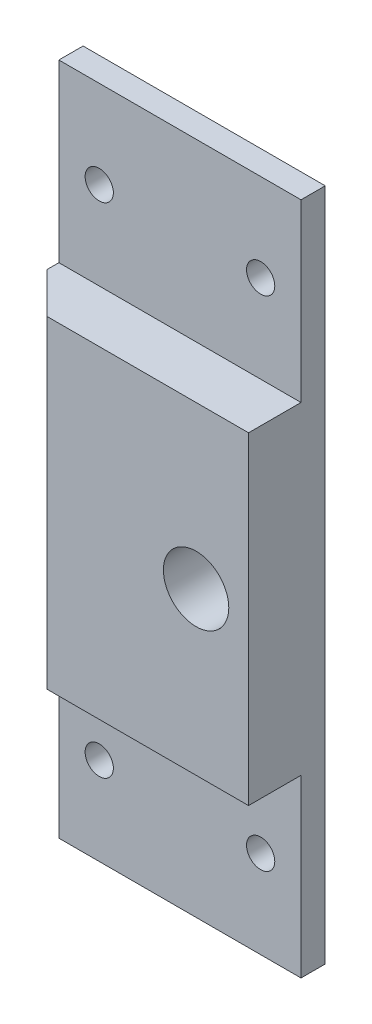
ISO-10303-21;
HEADER;
FILE_DESCRIPTION(('STEP AP214'),'2;1');
FILE_NAME('part.step','',(''),(''),'','','');
FILE_SCHEMA(('AUTOMOTIVE_DESIGN { 1 0 10303 214 1 1 1 1 }'));
ENDSEC;
DATA;
#1=APPLICATION_CONTEXT('core data for automotive mechanical design processes');
#2=APPLICATION_PROTOCOL_DEFINITION('international standard','automotive_design',2000,#1);
#3=PRODUCT_CONTEXT('',#1,'mechanical');
#4=PRODUCT('Part','Part','',(#3));
#5=PRODUCT_RELATED_PRODUCT_CATEGORY('part','',(#4));
#6=PRODUCT_DEFINITION_FORMATION('','',#4);
#7=PRODUCT_DEFINITION_CONTEXT('part definition',#1,'design');
#8=PRODUCT_DEFINITION('design','',#6,#7);
#9=PRODUCT_DEFINITION_SHAPE('','',#8);
#10=(LENGTH_UNIT() NAMED_UNIT(*) SI_UNIT(.MILLI.,.METRE.));
#11=(NAMED_UNIT(*) PLANE_ANGLE_UNIT() SI_UNIT($,.RADIAN.));
#12=(NAMED_UNIT(*) SI_UNIT($,.STERADIAN.) SOLID_ANGLE_UNIT());
#13=UNCERTAINTY_MEASURE_WITH_UNIT(LENGTH_MEASURE(1.E-05),#10,'distance_accuracy_value','');
#14=(GEOMETRIC_REPRESENTATION_CONTEXT(3) GLOBAL_UNCERTAINTY_ASSIGNED_CONTEXT((#13)) GLOBAL_UNIT_ASSIGNED_CONTEXT((#10,
#11,#12)) REPRESENTATION_CONTEXT('',''));
#15=CARTESIAN_POINT('',(0.,0.,0.));
#16=DIRECTION('',(0.,0.,1.));
#17=DIRECTION('',(1.,0.,0.));
#18=AXIS2_PLACEMENT_3D('',#15,#16,#17);
#19=CARTESIAN_POINT('',(0.,167.,3.));
#20=DIRECTION('',(0.,0.,-1.));
#21=DIRECTION('',(-1.,0.,0.));
#22=AXIS2_PLACEMENT_3D('',#19,#20,#21);
#23=PLANE('',#22);
#24=CARTESIAN_POINT('',(25.,94.375,3.));
#25=DIRECTION('',(0.,0.,1.));
#26=DIRECTION('',(1.,0.,0.));
#27=AXIS2_PLACEMENT_3D('',#24,#25,#26);
#28=CIRCLE('',#27,1.75);
#29=CARTESIAN_POINT('',(26.75,94.375,3.));
#30=VERTEX_POINT('',#29);
#31=EDGE_CURVE('E186',#30,#30,#28,.T.);
#32=ORIENTED_EDGE('',*,*,#31,.F.);
#33=EDGE_LOOP('',(#32));
#34=FACE_BOUND('',#33,.T.);
#35=CARTESIAN_POINT('',(5.,94.375,3.));
#36=DIRECTION('',(0.,0.,1.));
#37=DIRECTION('',(1.,0.,0.));
#38=AXIS2_PLACEMENT_3D('',#35,#36,#37);
#39=CIRCLE('',#38,1.75);
#40=CARTESIAN_POINT('',(6.75,94.375,3.));
#41=VERTEX_POINT('',#40);
#42=EDGE_CURVE('E182',#41,#41,#39,.T.);
#43=ORIENTED_EDGE('',*,*,#42,.F.);
#44=EDGE_LOOP('',(#43));
#45=FACE_BOUND('',#44,.T.);
#46=DIRECTION('',(-1.,0.,0.));
#47=VECTOR('',#46,1.);
#48=CARTESIAN_POINT('',(0.,105.25,3.));
#49=LINE('',#48,#47);
#50=CARTESIAN_POINT('',(30.,105.25,3.));
#51=VERTEX_POINT('',#50);
#52=CARTESIAN_POINT('',(0.,105.25,3.));
#53=VERTEX_POINT('',#52);
#54=EDGE_CURVE('E114',#51,#53,#49,.T.);
#55=ORIENTED_EDGE('',*,*,#54,.T.);
#56=DIRECTION('',(0.,1.,0.));
#57=VECTOR('',#56,1.);
#58=CARTESIAN_POINT('',(0.,167.,3.));
#59=LINE('',#58,#57);
#60=CARTESIAN_POINT('',(0.,83.5,3.));
#61=VERTEX_POINT('',#60);
#62=EDGE_CURVE('E135',#61,#53,#59,.T.);
#63=ORIENTED_EDGE('',*,*,#62,.F.);
#64=DIRECTION('',(-1.,0.,0.));
#65=VECTOR('',#64,1.);
#66=CARTESIAN_POINT('',(0.,83.5,3.));
#67=LINE('',#66,#65);
#68=CARTESIAN_POINT('',(30.,83.5,3.));
#69=VERTEX_POINT('',#68);
#70=EDGE_CURVE('E144',#69,#61,#67,.T.);
#71=ORIENTED_EDGE('',*,*,#70,.F.);
#72=DIRECTION('',(0.,-1.,0.));
#73=VECTOR('',#72,1.);
#74=CARTESIAN_POINT('',(30.,167.,3.));
#75=LINE('',#74,#73);
#76=EDGE_CURVE('E142',#51,#69,#75,.T.);
#77=ORIENTED_EDGE('',*,*,#76,.F.);
#78=EDGE_LOOP('',(#55,#63,#71,#77));
#79=FACE_BOUND('',#78,.T.);
#80=ADVANCED_FACE('F35',(#34,#45,#79),#23,.F.);
#81=CARTESIAN_POINT('',(25.,156.125,3.));
#82=DIRECTION('',(0.,0.,-1.));
#83=DIRECTION('',(1.,0.,0.));
#84=AXIS2_PLACEMENT_3D('',#81,#82,#83);
#85=CIRCLE('',#84,1.75);
#86=CARTESIAN_POINT('',(26.75,156.125,3.));
#87=VERTEX_POINT('',#86);
#88=EDGE_CURVE('E178',#87,#87,#85,.T.);
#89=ORIENTED_EDGE('',*,*,#88,.T.);
#90=EDGE_LOOP('',(#89));
#91=FACE_BOUND('',#90,.T.);
#92=CARTESIAN_POINT('',(5.,156.125,3.));
#93=DIRECTION('',(0.,0.,-1.));
#94=DIRECTION('',(1.,0.,0.));
#95=AXIS2_PLACEMENT_3D('',#92,#93,#94);
#96=CIRCLE('',#95,1.75);
#97=CARTESIAN_POINT('',(6.75,156.125,3.));
#98=VERTEX_POINT('',#97);
#99=EDGE_CURVE('E174',#98,#98,#96,.T.);
#100=ORIENTED_EDGE('',*,*,#99,.T.);
#101=EDGE_LOOP('',(#100));
#102=FACE_BOUND('',#101,.T.);
#103=DIRECTION('',(1.,0.,0.));
#104=VECTOR('',#103,1.);
#105=CARTESIAN_POINT('',(0.,145.25,3.));
#106=LINE('',#105,#104);
#107=CARTESIAN_POINT('',(0.,145.25,3.));
#108=VERTEX_POINT('',#107);
#109=CARTESIAN_POINT('',(30.,145.25,3.));
#110=VERTEX_POINT('',#109);
#111=EDGE_CURVE('E173',#108,#110,#106,.T.);
#112=ORIENTED_EDGE('',*,*,#111,.T.);
#113=CARTESIAN_POINT('',(30.,167.,3.));
#114=VERTEX_POINT('',#113);
#115=EDGE_CURVE('E124',#114,#110,#75,.T.);
#116=ORIENTED_EDGE('',*,*,#115,.F.);
#117=DIRECTION('',(1.,0.,0.));
#118=VECTOR('',#117,1.);
#119=CARTESIAN_POINT('',(0.,167.,3.));
#120=LINE('',#119,#118);
#121=CARTESIAN_POINT('',(0.,167.,3.));
#122=VERTEX_POINT('',#121);
#123=EDGE_CURVE('E138',#122,#114,#120,.T.);
#124=ORIENTED_EDGE('',*,*,#123,.F.);
#125=EDGE_CURVE('E139',#108,#122,#59,.T.);
#126=ORIENTED_EDGE('',*,*,#125,.F.);
#127=EDGE_LOOP('',(#112,#116,#124,#126));
#128=FACE_BOUND('',#127,.T.);
#129=ADVANCED_FACE('F228',(#91,#102,#128),#23,.F.);
#130=CARTESIAN_POINT('',(0.,167.,3.));
#131=DIRECTION('',(1.,0.,0.));
#132=DIRECTION('',(0.,0.,-1.));
#133=AXIS2_PLACEMENT_3D('',#130,#131,#132);
#134=PLANE('',#133);
#135=DIRECTION('',(0.,0.,-1.));
#136=VECTOR('',#135,1.);
#137=CARTESIAN_POINT('',(0.,145.25,9.5));
#138=LINE('',#137,#136);
#139=CARTESIAN_POINT('',(0.,145.25,4.49999999999997));
#140=VERTEX_POINT('',#139);
#141=EDGE_CURVE('E126',#140,#108,#138,.T.);
#142=ORIENTED_EDGE('',*,*,#141,.T.);
#143=ORIENTED_EDGE('',*,*,#125,.T.);
#144=DIRECTION('',(0.,0.,-1.));
#145=VECTOR('',#144,1.);
#146=CARTESIAN_POINT('',(0.,167.,3.));
#147=LINE('',#146,#145);
#148=CARTESIAN_POINT('',(0.,167.,0.));
#149=VERTEX_POINT('',#148);
#150=EDGE_CURVE('E166',#122,#149,#147,.T.);
#151=ORIENTED_EDGE('',*,*,#150,.T.);
#152=DIRECTION('',(0.,1.,0.));
#153=VECTOR('',#152,1.);
#154=CARTESIAN_POINT('',(0.,167.,0.));
#155=LINE('',#154,#153);
#156=CARTESIAN_POINT('',(0.,83.5,0.));
#157=VERTEX_POINT('',#156);
#158=EDGE_CURVE('E129',#157,#149,#155,.T.);
#159=ORIENTED_EDGE('',*,*,#158,.F.);
#160=DIRECTION('',(0.,0.,-1.));
#161=VECTOR('',#160,1.);
#162=CARTESIAN_POINT('',(0.,83.5,3.));
#163=LINE('',#162,#161);
#164=EDGE_CURVE('E147',#61,#157,#163,.T.);
#165=ORIENTED_EDGE('',*,*,#164,.F.);
#166=ORIENTED_EDGE('',*,*,#62,.T.);
#167=DIRECTION('',(0.,0.,-1.));
#168=VECTOR('',#167,1.);
#169=CARTESIAN_POINT('',(0.,105.25,9.5));
#170=LINE('',#169,#168);
#171=CARTESIAN_POINT('',(0.,105.25,4.49999999999997));
#172=VERTEX_POINT('',#171);
#173=EDGE_CURVE('E131',#172,#53,#170,.T.);
#174=ORIENTED_EDGE('',*,*,#173,.F.);
#175=DIRECTION('',(0.,-1.,0.));
#176=VECTOR('',#175,1.);
#177=CARTESIAN_POINT('',(0.,105.25,4.49999999999997));
#178=LINE('',#177,#176);
#179=EDGE_CURVE('E43',#140,#172,#178,.T.);
#180=ORIENTED_EDGE('',*,*,#179,.F.);
#181=EDGE_LOOP('',(#142,#143,#151,#159,#165,#166,#174,#180));
#182=FACE_BOUND('',#181,.T.);
#183=ADVANCED_FACE('F190',(#182),#134,.F.);
#184=CARTESIAN_POINT('',(0.,167.,3.));
#185=DIRECTION('',(0.,-1.,0.));
#186=DIRECTION('',(0.,0.,1.));
#187=AXIS2_PLACEMENT_3D('',#184,#185,#186);
#188=PLANE('',#187);
#189=DIRECTION('',(1.,0.,0.));
#190=VECTOR('',#189,1.);
#191=CARTESIAN_POINT('',(0.,167.,0.));
#192=LINE('',#191,#190);
#193=CARTESIAN_POINT('',(30.,167.,0.));
#194=VERTEX_POINT('',#193);
#195=EDGE_CURVE('E150',#149,#194,#192,.T.);
#196=ORIENTED_EDGE('',*,*,#195,.F.);
#197=ORIENTED_EDGE('',*,*,#150,.F.);
#198=ORIENTED_EDGE('',*,*,#123,.T.);
#199=DIRECTION('',(0.,0.,-1.));
#200=VECTOR('',#199,1.);
#201=CARTESIAN_POINT('',(30.,167.,3.));
#202=LINE('',#201,#200);
#203=EDGE_CURVE('E163',#114,#194,#202,.T.);
#204=ORIENTED_EDGE('',*,*,#203,.T.);
#205=EDGE_LOOP('',(#196,#197,#198,#204));
#206=FACE_BOUND('',#205,.T.);
#207=ADVANCED_FACE('F250',(#206),#188,.F.);
#208=CARTESIAN_POINT('',(30.,167.,3.));
#209=DIRECTION('',(-1.,0.,0.));
#210=DIRECTION('',(0.,0.,1.));
#211=AXIS2_PLACEMENT_3D('',#208,#209,#210);
#212=PLANE('',#211);
#213=DIRECTION('',(0.,-1.,0.));
#214=VECTOR('',#213,1.);
#215=CARTESIAN_POINT('',(30.,167.,0.));
#216=LINE('',#215,#214);
#217=CARTESIAN_POINT('',(30.,83.5,0.));
#218=VERTEX_POINT('',#217);
#219=EDGE_CURVE('E153',#194,#218,#216,.T.);
#220=ORIENTED_EDGE('',*,*,#219,.F.);
#221=ORIENTED_EDGE('',*,*,#203,.F.);
#222=ORIENTED_EDGE('',*,*,#115,.T.);
#223=DIRECTION('',(0.,0.,-1.));
#224=VECTOR('',#223,1.);
#225=CARTESIAN_POINT('',(30.,145.25,9.5));
#226=LINE('',#225,#224);
#227=CARTESIAN_POINT('',(30.,145.25,9.5));
#228=VERTEX_POINT('',#227);
#229=EDGE_CURVE('E109',#228,#110,#226,.T.);
#230=ORIENTED_EDGE('',*,*,#229,.F.);
#231=DIRECTION('',(0.,-1.,0.));
#232=VECTOR('',#231,1.);
#233=CARTESIAN_POINT('',(30.,105.25,9.5));
#234=LINE('',#233,#232);
#235=CARTESIAN_POINT('',(30.,105.25,9.5));
#236=VERTEX_POINT('',#235);
#237=EDGE_CURVE('E113',#228,#236,#234,.T.);
#238=ORIENTED_EDGE('',*,*,#237,.T.);
#239=DIRECTION('',(0.,0.,-1.));
#240=VECTOR('',#239,1.);
#241=CARTESIAN_POINT('',(30.,105.25,9.5));
#242=LINE('',#241,#240);
#243=EDGE_CURVE('E127',#236,#51,#242,.T.);
#244=ORIENTED_EDGE('',*,*,#243,.T.);
#245=ORIENTED_EDGE('',*,*,#76,.T.);
#246=DIRECTION('',(0.,0.,-1.));
#247=VECTOR('',#246,1.);
#248=CARTESIAN_POINT('',(30.,83.5,3.));
#249=LINE('',#248,#247);
#250=EDGE_CURVE('E160',#69,#218,#249,.T.);
#251=ORIENTED_EDGE('',*,*,#250,.T.);
#252=EDGE_LOOP('',(#220,#221,#222,#230,#238,#244,#245,#251));
#253=FACE_BOUND('',#252,.T.);
#254=ADVANCED_FACE('F122',(#253),#212,.F.);
#255=CARTESIAN_POINT('',(0.,83.5,3.));
#256=DIRECTION('',(0.,1.,0.));
#257=DIRECTION('',(0.,0.,-1.));
#258=AXIS2_PLACEMENT_3D('',#255,#256,#257);
#259=PLANE('',#258);
#260=DIRECTION('',(-1.,0.,0.));
#261=VECTOR('',#260,1.);
#262=CARTESIAN_POINT('',(0.,83.5,0.));
#263=LINE('',#262,#261);
#264=EDGE_CURVE('E156',#218,#157,#263,.T.);
#265=ORIENTED_EDGE('',*,*,#264,.F.);
#266=ORIENTED_EDGE('',*,*,#250,.F.);
#267=ORIENTED_EDGE('',*,*,#70,.T.);
#268=ORIENTED_EDGE('',*,*,#164,.T.);
#269=EDGE_LOOP('',(#265,#266,#267,#268));
#270=FACE_BOUND('',#269,.T.);
#271=ADVANCED_FACE('F243',(#270),#259,.F.);
#272=CARTESIAN_POINT('',(0.,167.,0.));
#273=DIRECTION('',(0.,0.,-1.));
#274=DIRECTION('',(-1.,0.,0.));
#275=AXIS2_PLACEMENT_3D('',#272,#273,#274);
#276=PLANE('',#275);
#277=CARTESIAN_POINT('',(23.5,125.25,0.));
#278=DIRECTION('',(0.,0.,1.));
#279=DIRECTION('',(-1.,0.,0.));
#280=AXIS2_PLACEMENT_3D('',#277,#278,#279);
#281=CIRCLE('',#280,4.05);
#282=CARTESIAN_POINT('',(27.55,125.25,0.));
#283=VERTEX_POINT('',#282);
#284=EDGE_CURVE('E206',#283,#283,#281,.T.);
#285=ORIENTED_EDGE('',*,*,#284,.T.);
#286=EDGE_LOOP('',(#285));
#287=FACE_BOUND('',#286,.T.);
#288=CARTESIAN_POINT('',(25.,94.375,0.));
#289=DIRECTION('',(0.,0.,1.));
#290=DIRECTION('',(-1.,0.,0.));
#291=AXIS2_PLACEMENT_3D('',#288,#289,#290);
#292=CIRCLE('',#291,1.75);
#293=CARTESIAN_POINT('',(23.25,94.375,0.));
#294=VERTEX_POINT('',#293);
#295=EDGE_CURVE('E183',#294,#294,#292,.F.);
#296=ORIENTED_EDGE('',*,*,#295,.F.);
#297=EDGE_LOOP('',(#296));
#298=FACE_BOUND('',#297,.T.);
#299=CARTESIAN_POINT('',(5.,94.375,0.));
#300=DIRECTION('',(0.,0.,1.));
#301=DIRECTION('',(-1.,0.,0.));
#302=AXIS2_PLACEMENT_3D('',#299,#300,#301);
#303=CIRCLE('',#302,1.75);
#304=CARTESIAN_POINT('',(3.25,94.375,0.));
#305=VERTEX_POINT('',#304);
#306=EDGE_CURVE('E179',#305,#305,#303,.F.);
#307=ORIENTED_EDGE('',*,*,#306,.F.);
#308=EDGE_LOOP('',(#307));
#309=FACE_BOUND('',#308,.T.);
#310=CARTESIAN_POINT('',(25.,156.125,0.));
#311=DIRECTION('',(0.,0.,1.));
#312=DIRECTION('',(-1.,0.,0.));
#313=AXIS2_PLACEMENT_3D('',#310,#311,#312);
#314=CIRCLE('',#313,1.75);
#315=CARTESIAN_POINT('',(23.25,156.125,0.));
#316=VERTEX_POINT('',#315);
#317=EDGE_CURVE('E175',#316,#316,#314,.T.);
#318=ORIENTED_EDGE('',*,*,#317,.T.);
#319=EDGE_LOOP('',(#318));
#320=FACE_BOUND('',#319,.T.);
#321=CARTESIAN_POINT('',(5.,156.125,0.));
#322=DIRECTION('',(0.,0.,1.));
#323=DIRECTION('',(-1.,0.,0.));
#324=AXIS2_PLACEMENT_3D('',#321,#322,#323);
#325=CIRCLE('',#324,1.75);
#326=CARTESIAN_POINT('',(3.25,156.125,0.));
#327=VERTEX_POINT('',#326);
#328=EDGE_CURVE('E170',#327,#327,#325,.T.);
#329=ORIENTED_EDGE('',*,*,#328,.T.);
#330=EDGE_LOOP('',(#329));
#331=FACE_BOUND('',#330,.T.);
#332=ORIENTED_EDGE('',*,*,#158,.T.);
#333=ORIENTED_EDGE('',*,*,#195,.T.);
#334=ORIENTED_EDGE('',*,*,#219,.T.);
#335=ORIENTED_EDGE('',*,*,#264,.T.);
#336=EDGE_LOOP('',(#332,#333,#334,#335));
#337=FACE_BOUND('',#336,.T.);
#338=ADVANCED_FACE('F240',(#287,#298,#309,#320,#331,#337),#276,.T.);
#339=CARTESIAN_POINT('',(0.,145.25,9.5));
#340=DIRECTION('',(0.,-1.,0.));
#341=DIRECTION('',(0.,0.,1.));
#342=AXIS2_PLACEMENT_3D('',#339,#340,#341);
#343=PLANE('',#342);
#344=DIRECTION('',(1.,0.,0.));
#345=VECTOR('',#344,1.);
#346=CARTESIAN_POINT('',(0.,145.25,9.5));
#347=LINE('',#346,#345);
#348=CARTESIAN_POINT('',(5.00000000000002,145.25,9.5));
#349=VERTEX_POINT('',#348);
#350=EDGE_CURVE('E104',#349,#228,#347,.T.);
#351=ORIENTED_EDGE('',*,*,#350,.T.);
#352=ORIENTED_EDGE('',*,*,#229,.T.);
#353=ORIENTED_EDGE('',*,*,#111,.F.);
#354=ORIENTED_EDGE('',*,*,#141,.F.);
#355=DIRECTION('',(-0.707106781186546,0.,-0.707106781186548));
#356=VECTOR('',#355,1.);
#357=CARTESIAN_POINT('',(5.00000000000002,145.25,9.5));
#358=LINE('',#357,#356);
#359=EDGE_CURVE('E55',#349,#140,#358,.T.);
#360=ORIENTED_EDGE('',*,*,#359,.F.);
#361=EDGE_LOOP('',(#351,#352,#353,#354,#360));
#362=FACE_BOUND('',#361,.T.);
#363=ADVANCED_FACE('F106',(#362),#343,.F.);
#364=CARTESIAN_POINT('',(0.,105.25,9.5));
#365=DIRECTION('',(0.,1.,0.));
#366=DIRECTION('',(0.,0.,-1.));
#367=AXIS2_PLACEMENT_3D('',#364,#365,#366);
#368=PLANE('',#367);
#369=ORIENTED_EDGE('',*,*,#173,.T.);
#370=ORIENTED_EDGE('',*,*,#54,.F.);
#371=ORIENTED_EDGE('',*,*,#243,.F.);
#372=DIRECTION('',(-1.,0.,0.));
#373=VECTOR('',#372,1.);
#374=CARTESIAN_POINT('',(0.,105.25,9.5));
#375=LINE('',#374,#373);
#376=CARTESIAN_POINT('',(5.00000000000002,105.25,9.5));
#377=VERTEX_POINT('',#376);
#378=EDGE_CURVE('E118',#236,#377,#375,.T.);
#379=ORIENTED_EDGE('',*,*,#378,.T.);
#380=DIRECTION('',(0.707106781186546,0.,0.707106781186548));
#381=VECTOR('',#380,1.);
#382=CARTESIAN_POINT('',(5.00000000000002,105.25,9.5));
#383=LINE('',#382,#381);
#384=EDGE_CURVE('E11',#172,#377,#383,.T.);
#385=ORIENTED_EDGE('',*,*,#384,.F.);
#386=EDGE_LOOP('',(#369,#370,#371,#379,#385));
#387=FACE_BOUND('',#386,.T.);
#388=ADVANCED_FACE('F280',(#387),#368,.F.);
#389=CARTESIAN_POINT('',(0.,167.,9.5));
#390=DIRECTION('',(0.,0.,1.));
#391=DIRECTION('',(1.,0.,0.));
#392=AXIS2_PLACEMENT_3D('',#389,#390,#391);
#393=PLANE('',#392);
#394=CARTESIAN_POINT('',(23.5,125.25,9.5));
#395=DIRECTION('',(0.,0.,-1.));
#396=DIRECTION('',(1.,0.,0.));
#397=AXIS2_PLACEMENT_3D('',#394,#395,#396);
#398=CIRCLE('',#397,4.05);
#399=CARTESIAN_POINT('',(27.55,125.25,9.5));
#400=VERTEX_POINT('',#399);
#401=EDGE_CURVE('E209',#400,#400,#398,.T.);
#402=ORIENTED_EDGE('',*,*,#401,.T.);
#403=EDGE_LOOP('',(#402));
#404=FACE_BOUND('',#403,.T.);
#405=ORIENTED_EDGE('',*,*,#378,.F.);
#406=ORIENTED_EDGE('',*,*,#237,.F.);
#407=ORIENTED_EDGE('',*,*,#350,.F.);
#408=DIRECTION('',(0.,1.,0.));
#409=VECTOR('',#408,1.);
#410=CARTESIAN_POINT('',(5.00000000000002,145.25,9.5));
#411=LINE('',#410,#409);
#412=EDGE_CURVE('E169',#377,#349,#411,.T.);
#413=ORIENTED_EDGE('',*,*,#412,.F.);
#414=EDGE_LOOP('',(#405,#406,#407,#413));
#415=FACE_BOUND('',#414,.T.);
#416=ADVANCED_FACE('F117',(#404,#415),#393,.T.);
#417=CARTESIAN_POINT('',(5.,156.125,-4.));
#418=DIRECTION('',(0.,0.,1.));
#419=DIRECTION('',(1.,0.,0.));
#420=AXIS2_PLACEMENT_3D('',#417,#418,#419);
#421=CYLINDRICAL_SURFACE('',#420,1.75);
#422=ORIENTED_EDGE('',*,*,#328,.F.);
#423=EDGE_LOOP('',(#422));
#424=FACE_BOUND('',#423,.T.);
#425=ORIENTED_EDGE('',*,*,#99,.F.);
#426=EDGE_LOOP('',(#425));
#427=FACE_BOUND('',#426,.T.);
#428=ADVANCED_FACE('F291',(#424,#427),#421,.F.);
#429=CARTESIAN_POINT('',(25.,156.125,-4.));
#430=DIRECTION('',(0.,0.,1.));
#431=DIRECTION('',(1.,0.,0.));
#432=AXIS2_PLACEMENT_3D('',#429,#430,#431);
#433=CYLINDRICAL_SURFACE('',#432,1.75);
#434=ORIENTED_EDGE('',*,*,#317,.F.);
#435=EDGE_LOOP('',(#434));
#436=FACE_BOUND('',#435,.T.);
#437=ORIENTED_EDGE('',*,*,#88,.F.);
#438=EDGE_LOOP('',(#437));
#439=FACE_BOUND('',#438,.T.);
#440=ADVANCED_FACE('F298',(#436,#439),#433,.F.);
#441=CARTESIAN_POINT('',(5.,94.375,-4.));
#442=DIRECTION('',(0.,0.,1.));
#443=DIRECTION('',(1.,0.,0.));
#444=AXIS2_PLACEMENT_3D('',#441,#442,#443);
#445=CYLINDRICAL_SURFACE('',#444,1.75);
#446=ORIENTED_EDGE('',*,*,#306,.T.);
#447=EDGE_LOOP('',(#446));
#448=FACE_BOUND('',#447,.T.);
#449=ORIENTED_EDGE('',*,*,#42,.T.);
#450=EDGE_LOOP('',(#449));
#451=FACE_BOUND('',#450,.T.);
#452=ADVANCED_FACE('F223',(#448,#451),#445,.F.);
#453=CARTESIAN_POINT('',(25.,94.375,-4.));
#454=DIRECTION('',(0.,0.,1.));
#455=DIRECTION('',(1.,0.,0.));
#456=AXIS2_PLACEMENT_3D('',#453,#454,#455);
#457=CYLINDRICAL_SURFACE('',#456,1.75);
#458=ORIENTED_EDGE('',*,*,#295,.T.);
#459=EDGE_LOOP('',(#458));
#460=FACE_BOUND('',#459,.T.);
#461=ORIENTED_EDGE('',*,*,#31,.T.);
#462=EDGE_LOOP('',(#461));
#463=FACE_BOUND('',#462,.T.);
#464=ADVANCED_FACE('F216',(#460,#463),#457,.F.);
#465=CARTESIAN_POINT('',(23.5,125.25,-14.5));
#466=DIRECTION('',(0.,0.,1.));
#467=DIRECTION('',(1.,0.,0.));
#468=AXIS2_PLACEMENT_3D('',#465,#466,#467);
#469=CYLINDRICAL_SURFACE('',#468,4.05);
#470=CARTESIAN_POINT('',(27.55,125.25,0.));
#471=CARTESIAN_POINT('',(27.55,125.25,0.0989583333333334));
#472=CARTESIAN_POINT('',(27.55,125.25,0.197916666666667));
#473=CARTESIAN_POINT('',(27.55,125.25,0.395833333333334));
#474=CARTESIAN_POINT('',(27.55,125.25,0.494791666666667));
#475=CARTESIAN_POINT('',(27.55,125.25,0.692708333333334));
#476=CARTESIAN_POINT('',(27.55,125.25,0.791666666666667));
#477=CARTESIAN_POINT('',(27.55,125.25,0.989583333333334));
#478=CARTESIAN_POINT('',(27.55,125.25,1.08854166666667));
#479=CARTESIAN_POINT('',(27.55,125.25,1.28645833333333));
#480=CARTESIAN_POINT('',(27.55,125.25,1.38541666666666));
#481=CARTESIAN_POINT('',(27.55,125.25,1.58333333333333));
#482=CARTESIAN_POINT('',(27.55,125.25,1.68229166666667));
#483=CARTESIAN_POINT('',(27.55,125.25,1.88020833333333));
#484=CARTESIAN_POINT('',(27.55,125.25,1.97916666666667));
#485=CARTESIAN_POINT('',(27.55,125.25,2.17708333333333));
#486=CARTESIAN_POINT('',(27.55,125.25,2.27604166666667));
#487=CARTESIAN_POINT('',(27.55,125.25,2.47395833333333));
#488=CARTESIAN_POINT('',(27.55,125.25,2.57291666666667));
#489=CARTESIAN_POINT('',(27.55,125.25,2.77083333333333));
#490=CARTESIAN_POINT('',(27.55,125.25,2.86979166666666));
#491=CARTESIAN_POINT('',(27.55,125.25,3.06770833333333));
#492=CARTESIAN_POINT('',(27.55,125.25,3.16666666666667));
#493=CARTESIAN_POINT('',(27.55,125.25,3.36458333333333));
#494=CARTESIAN_POINT('',(27.55,125.25,3.46354166666667));
#495=CARTESIAN_POINT('',(27.55,125.25,3.66145833333333));
#496=CARTESIAN_POINT('',(27.55,125.25,3.76041666666667));
#497=CARTESIAN_POINT('',(27.55,125.25,3.95833333333333));
#498=CARTESIAN_POINT('',(27.55,125.25,4.05729166666667));
#499=CARTESIAN_POINT('',(27.55,125.25,4.25520833333333));
#500=CARTESIAN_POINT('',(27.55,125.25,4.35416666666667));
#501=CARTESIAN_POINT('',(27.55,125.25,4.55208333333333));
#502=CARTESIAN_POINT('',(27.55,125.25,4.65104166666667));
#503=CARTESIAN_POINT('',(27.55,125.25,4.84895833333333));
#504=CARTESIAN_POINT('',(27.55,125.25,4.94791666666666));
#505=CARTESIAN_POINT('',(27.55,125.25,5.14583333333333));
#506=CARTESIAN_POINT('',(27.55,125.25,5.24479166666667));
#507=CARTESIAN_POINT('',(27.55,125.25,5.44270833333333));
#508=CARTESIAN_POINT('',(27.55,125.25,5.54166666666667));
#509=CARTESIAN_POINT('',(27.55,125.25,5.73958333333333));
#510=CARTESIAN_POINT('',(27.55,125.25,5.83854166666667));
#511=CARTESIAN_POINT('',(27.55,125.25,6.03645833333333));
#512=CARTESIAN_POINT('',(27.55,125.25,6.13541666666667));
#513=CARTESIAN_POINT('',(27.55,125.25,6.33333333333333));
#514=CARTESIAN_POINT('',(27.55,125.25,6.43229166666667));
#515=CARTESIAN_POINT('',(27.55,125.25,6.63020833333333));
#516=CARTESIAN_POINT('',(27.55,125.25,6.72916666666667));
#517=CARTESIAN_POINT('',(27.55,125.25,6.92708333333333));
#518=CARTESIAN_POINT('',(27.55,125.25,7.02604166666667));
#519=CARTESIAN_POINT('',(27.55,125.25,7.22395833333333));
#520=CARTESIAN_POINT('',(27.55,125.25,7.32291666666667));
#521=CARTESIAN_POINT('',(27.55,125.25,7.52083333333333));
#522=CARTESIAN_POINT('',(27.55,125.25,7.61979166666667));
#523=CARTESIAN_POINT('',(27.55,125.25,7.81770833333333));
#524=CARTESIAN_POINT('',(27.55,125.25,7.91666666666667));
#525=CARTESIAN_POINT('',(27.55,125.25,8.11458333333333));
#526=CARTESIAN_POINT('',(27.55,125.25,8.21354166666667));
#527=CARTESIAN_POINT('',(27.55,125.25,8.41145833333333));
#528=CARTESIAN_POINT('',(27.55,125.25,8.51041666666667));
#529=CARTESIAN_POINT('',(27.55,125.25,8.70833333333333));
#530=CARTESIAN_POINT('',(27.55,125.25,8.80729166666667));
#531=CARTESIAN_POINT('',(27.55,125.25,9.00520833333333));
#532=CARTESIAN_POINT('',(27.55,125.25,9.10416666666666));
#533=CARTESIAN_POINT('',(27.55,125.25,9.30208333333333));
#534=CARTESIAN_POINT('',(27.55,125.25,9.40104166666666));
#535=CARTESIAN_POINT('',(27.55,125.25,9.5));
#536=B_SPLINE_CURVE_WITH_KNOTS('',3,(#470,#471,#472,#473,#474,#475,#476,#477,#478,#479,#480,
#481,#482,#483,#484,#485,#486,#487,#488,#489,#490,#491,#492,#493,#494,#495,#496,#497,#498,#499,
#500,#501,#502,#503,#504,#505,#506,#507,#508,#509,#510,#511,#512,#513,#514,#515,#516,#517,#518,
#519,#520,#521,#522,#523,#524,#525,#526,#527,#528,#529,#530,#531,#532,#533,#534,#535),
.UNSPECIFIED.,.F.,.F.,(4,2,2,2,2,2,2,2,2,2,2,2,2,2,2,2,2,2,2,2,2,2,2,2,2,2,2,2,2,2,2,2,4),(0.,
0.296875,0.593750000000001,0.890625000000001,1.1875,1.484375,1.78125,2.078125,2.375,2.671875,
2.96875,3.265625,3.5625,3.859375,4.15625,4.453125,4.75,5.046875,5.34375,5.640625,5.9375,
6.234375,6.53125,6.828125,7.125,7.421875,7.71875,8.015625,8.3125,8.609375,8.90625,9.203125,9.5),.UNSPECIFIED.);
#537=EDGE_CURVE('BSEAM214',#283,#400,#536,.T.);
#538=ORIENTED_EDGE('',*,*,#284,.F.);
#539=ORIENTED_EDGE('',*,*,#401,.F.);
#540=ORIENTED_EDGE('',*,*,#537,.T.);
#541=ORIENTED_EDGE('',*,*,#537,.F.);
#542=EDGE_LOOP('',(#538,#540,#539,#541));
#543=FACE_BOUND('',#542,.T.);
#544=ADVANCED_FACE('F214',(#543),#469,.F.);
#545=CARTESIAN_POINT('',(5.00000000000002,167.,9.5));
#546=DIRECTION('',(-0.707106781186548,0.,0.707106781186546));
#547=DIRECTION('',(0.,-1.,0.));
#548=AXIS2_PLACEMENT_3D('',#545,#546,#547);
#549=PLANE('',#548);
#550=ORIENTED_EDGE('',*,*,#384,.T.);
#551=ORIENTED_EDGE('',*,*,#412,.T.);
#552=ORIENTED_EDGE('',*,*,#359,.T.);
#553=ORIENTED_EDGE('',*,*,#179,.T.);
#554=EDGE_LOOP('',(#550,#551,#552,#553));
#555=FACE_BOUND('',#554,.T.);
#556=ADVANCED_FACE('F37',(#555),#549,.T.);
#557=CLOSED_SHELL('',(#80,#129,#183,#207,#254,#271,#338,#363,#388,#416,#428,#440,#452,#464,#544,#556));
#558=MANIFOLD_SOLID_BREP('B2',#557);
#559=ADVANCED_BREP_SHAPE_REPRESENTATION('',(#18,#558),#14);
#560=SHAPE_DEFINITION_REPRESENTATION(#9,#559);
ENDSEC;
END-ISO-10303-21;
